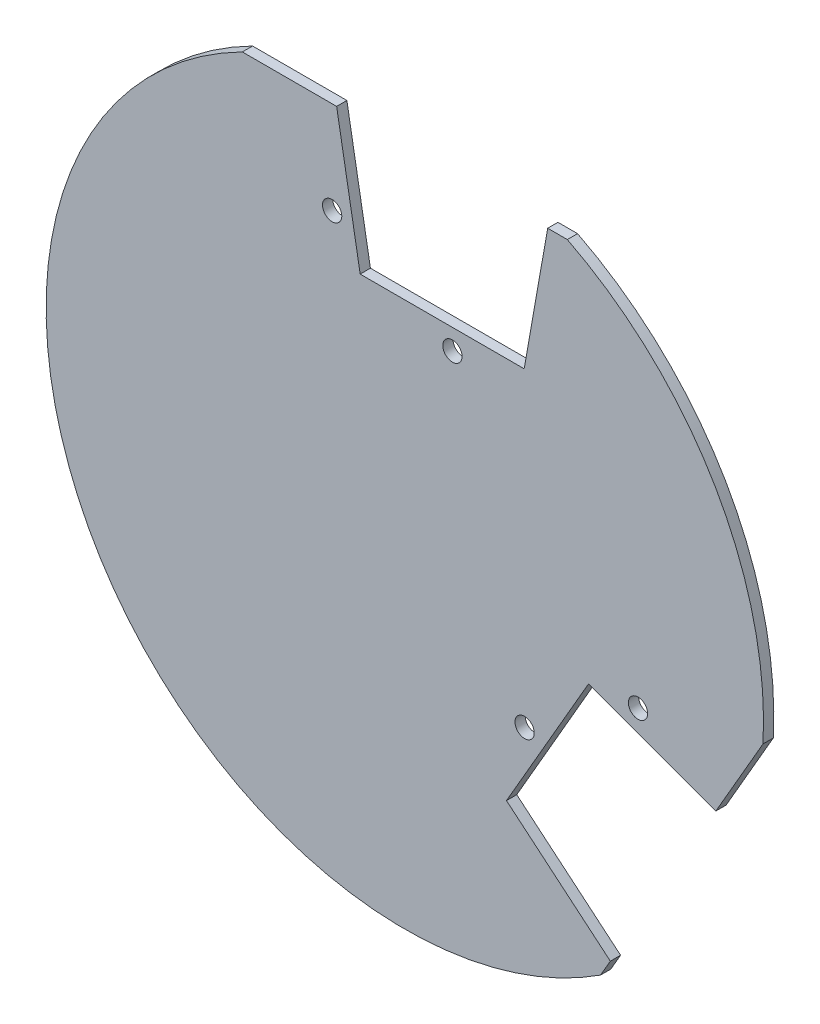
ISO-10303-21;
HEADER;
FILE_DESCRIPTION(('STEP AP214'),'2;1');
FILE_NAME('part.step','',(''),(''),'','','');
FILE_SCHEMA(('AUTOMOTIVE_DESIGN { 1 0 10303 214 1 1 1 1 }'));
ENDSEC;
DATA;
#1=APPLICATION_CONTEXT('core data for automotive mechanical design processes');
#2=APPLICATION_PROTOCOL_DEFINITION('international standard','automotive_design',2000,#1);
#3=PRODUCT_CONTEXT('',#1,'mechanical');
#4=PRODUCT('Part','Part','',(#3));
#5=PRODUCT_RELATED_PRODUCT_CATEGORY('part','',(#4));
#6=PRODUCT_DEFINITION_FORMATION('','',#4);
#7=PRODUCT_DEFINITION_CONTEXT('part definition',#1,'design');
#8=PRODUCT_DEFINITION('design','',#6,#7);
#9=PRODUCT_DEFINITION_SHAPE('','',#8);
#10=(LENGTH_UNIT() NAMED_UNIT(*) SI_UNIT(.MILLI.,.METRE.));
#11=(NAMED_UNIT(*) PLANE_ANGLE_UNIT() SI_UNIT($,.RADIAN.));
#12=(NAMED_UNIT(*) SI_UNIT($,.STERADIAN.) SOLID_ANGLE_UNIT());
#13=UNCERTAINTY_MEASURE_WITH_UNIT(LENGTH_MEASURE(1.E-05),#10,'distance_accuracy_value','');
#14=(GEOMETRIC_REPRESENTATION_CONTEXT(3) GLOBAL_UNCERTAINTY_ASSIGNED_CONTEXT((#13)) GLOBAL_UNIT_ASSIGNED_CONTEXT((#10,
#11,#12)) REPRESENTATION_CONTEXT('',''));
#15=CARTESIAN_POINT('',(0.,0.,0.));
#16=DIRECTION('',(0.,0.,1.));
#17=DIRECTION('',(1.,0.,0.));
#18=AXIS2_PLACEMENT_3D('',#15,#16,#17);
#19=CARTESIAN_POINT('',(0.,0.,5.));
#20=DIRECTION('',(0.,0.,-1.));
#21=DIRECTION('',(-1.,0.,0.));
#22=AXIS2_PLACEMENT_3D('',#19,#20,#21);
#23=CYLINDRICAL_SURFACE('',#22,175.);
#24=CARTESIAN_POINT('',(0.,0.,0.));
#25=DIRECTION('',(0.,0.,1.));
#26=DIRECTION('',(1.,0.,0.));
#27=AXIS2_PLACEMENT_3D('',#24,#25,#26);
#28=CIRCLE('',#27,175.);
#29=CARTESIAN_POINT('',(-79.2733847732147,156.015161015197,0.));
#30=VERTEX_POINT('',#29);
#31=CARTESIAN_POINT('',(95.4764004280729,-146.660345565181,0.));
#32=VERTEX_POINT('',#31);
#33=EDGE_CURVE('E238',#30,#32,#28,.T.);
#34=ORIENTED_EDGE('',*,*,#33,.T.);
#35=DIRECTION('',(0.,0.,-1.));
#36=VECTOR('',#35,1.);
#37=CARTESIAN_POINT('',(95.4764004280728,-146.660345565181,5.));
#38=LINE('',#37,#36);
#39=CARTESIAN_POINT('',(95.4764004280729,-146.660345565181,5.));
#40=VERTEX_POINT('',#39);
#41=EDGE_CURVE('E160',#32,#40,#38,.F.);
#42=ORIENTED_EDGE('',*,*,#41,.T.);
#43=CARTESIAN_POINT('',(0.,0.,5.));
#44=DIRECTION('',(0.,0.,1.));
#45=DIRECTION('',(1.,0.,0.));
#46=AXIS2_PLACEMENT_3D('',#43,#44,#45);
#47=CIRCLE('',#46,175.);
#48=CARTESIAN_POINT('',(-79.2733847732147,156.015161015197,5.));
#49=VERTEX_POINT('',#48);
#50=EDGE_CURVE('E234',#49,#40,#47,.T.);
#51=ORIENTED_EDGE('',*,*,#50,.F.);
#52=DIRECTION('',(0.,0.,-1.));
#53=VECTOR('',#52,1.);
#54=CARTESIAN_POINT('',(-79.2733847732147,156.015161015197,5.));
#55=LINE('',#54,#53);
#56=EDGE_CURVE('E201',#49,#30,#55,.T.);
#57=ORIENTED_EDGE('',*,*,#56,.T.);
#58=EDGE_LOOP('',(#34,#42,#51,#57));
#59=FACE_BOUND('',#58,.T.);
#60=ADVANCED_FACE('F33',(#59),#23,.T.);
#61=CARTESIAN_POINT('',(174.749785201287,-9.35481545001618,5.));
#62=VERTEX_POINT('',#61);
#63=CARTESIAN_POINT('',(79.2733847732147,156.015161015197,5.));
#64=VERTEX_POINT('',#63);
#65=EDGE_CURVE('E237',#62,#64,#47,.T.);
#66=ORIENTED_EDGE('',*,*,#65,.F.);
#67=DIRECTION('',(0.,0.,-1.));
#68=VECTOR('',#67,1.);
#69=CARTESIAN_POINT('',(174.749785201287,-9.35481545001618,5.));
#70=LINE('',#69,#68);
#71=CARTESIAN_POINT('',(174.749785201287,-9.35481545001618,0.));
#72=VERTEX_POINT('',#71);
#73=EDGE_CURVE('E164',#62,#72,#70,.T.);
#74=ORIENTED_EDGE('',*,*,#73,.T.);
#75=CARTESIAN_POINT('',(79.2733847732147,156.015161015197,0.));
#76=VERTEX_POINT('',#75);
#77=EDGE_CURVE('E231',#72,#76,#28,.T.);
#78=ORIENTED_EDGE('',*,*,#77,.T.);
#79=DIRECTION('',(0.,0.,-1.));
#80=VECTOR('',#79,1.);
#81=CARTESIAN_POINT('',(79.2733847732147,156.015161015197,5.));
#82=LINE('',#81,#80);
#83=EDGE_CURVE('E197',#76,#64,#82,.F.);
#84=ORIENTED_EDGE('',*,*,#83,.T.);
#85=EDGE_LOOP('',(#66,#74,#78,#84));
#86=FACE_BOUND('',#85,.T.);
#87=ADVANCED_FACE('F35',(#86),#23,.T.);
#88=CARTESIAN_POINT('',(0.,0.,5.));
#89=DIRECTION('',(0.,0.,1.));
#90=DIRECTION('',(1.,0.,0.));
#91=AXIS2_PLACEMENT_3D('',#88,#89,#90);
#92=PLANE('',#91);
#93=DIRECTION('',(0.5,0.866025403784439,0.));
#94=VECTOR('',#93,1.);
#95=CARTESIAN_POINT('',(100.261007389645,-138.373163213491,5.));
#96=LINE('',#95,#94);
#97=CARTESIAN_POINT('',(100.261007389645,-138.373163213491,5.));
#98=VERTEX_POINT('',#97);
#99=EDGE_CURVE('E151',#40,#98,#96,.T.);
#100=ORIENTED_EDGE('',*,*,#99,.T.);
#101=DIRECTION('',(-0.766044443118982,0.642787609686535,0.));
#102=VECTOR('',#101,1.);
#103=CARTESIAN_POINT('',(49.6007680483994,-95.8641750668996,5.));
#104=LINE('',#103,#102);
#105=CARTESIAN_POINT('',(49.6007680483994,-95.8641750668996,5.));
#106=VERTEX_POINT('',#105);
#107=EDGE_CURVE('E130',#98,#106,#104,.T.);
#108=ORIENTED_EDGE('',*,*,#107,.T.);
#109=DIRECTION('',(0.5,0.866025403784439,0.));
#110=VECTOR('',#109,1.);
#111=CARTESIAN_POINT('',(89.6007680483994,-26.5821427641446,5.));
#112=LINE('',#111,#110);
#113=CARTESIAN_POINT('',(89.6007680483994,-26.5821427641446,5.));
#114=VERTEX_POINT('',#113);
#115=EDGE_CURVE('E124',#106,#114,#112,.T.);
#116=ORIENTED_EDGE('',*,*,#115,.T.);
#117=DIRECTION('',(0.939692620785906,-0.342020143325675,0.));
#118=VECTOR('',#117,1.);
#119=CARTESIAN_POINT('',(89.6007680483994,-26.5821427641446,5.));
#120=LINE('',#119,#118);
#121=CARTESIAN_POINT('',(151.744751343142,-49.2007029221673,5.));
#122=VERTEX_POINT('',#121);
#123=EDGE_CURVE('E133',#114,#122,#120,.T.);
#124=ORIENTED_EDGE('',*,*,#123,.T.);
#125=DIRECTION('',(0.5,0.866025403784439,0.));
#126=VECTOR('',#125,1.);
#127=CARTESIAN_POINT('',(151.744751343142,-49.2007029221673,5.));
#128=LINE('',#127,#126);
#129=EDGE_CURVE('E138',#122,#62,#128,.T.);
#130=ORIENTED_EDGE('',*,*,#129,.T.);
#131=ORIENTED_EDGE('',*,*,#65,.T.);
#132=DIRECTION('',(-1.,0.,0.));
#133=VECTOR('',#132,1.);
#134=CARTESIAN_POINT('',(69.704170850071,156.015161015197,5.));
#135=LINE('',#134,#133);
#136=CARTESIAN_POINT('',(69.704170850071,156.015161015197,5.));
#137=VERTEX_POINT('',#136);
#138=EDGE_CURVE('E180',#64,#137,#135,.T.);
#139=ORIENTED_EDGE('',*,*,#138,.T.);
#140=DIRECTION('',(-0.173648177666924,-0.984807753012209,0.));
#141=VECTOR('',#140,1.);
#142=CARTESIAN_POINT('',(58.2204268965742,90.8876127105832,5.));
#143=LINE('',#142,#141);
#144=CARTESIAN_POINT('',(58.2204268965742,90.8876127105832,5.));
#145=VERTEX_POINT('',#144);
#146=EDGE_CURVE('E183',#137,#145,#143,.T.);
#147=ORIENTED_EDGE('',*,*,#146,.T.);
#148=DIRECTION('',(-1.,0.,0.));
#149=VECTOR('',#148,1.);
#150=CARTESIAN_POINT('',(-21.7795731034258,90.8876127105832,5.));
#151=LINE('',#150,#149);
#152=CARTESIAN_POINT('',(-21.7795731034258,90.8876127105832,5.));
#153=VERTEX_POINT('',#152);
#154=EDGE_CURVE('E170',#145,#153,#151,.T.);
#155=ORIENTED_EDGE('',*,*,#154,.T.);
#156=DIRECTION('',(-0.173648177666924,0.984807753012209,0.));
#157=VECTOR('',#156,1.);
#158=CARTESIAN_POINT('',(-21.7795731034258,90.8876127105832,5.));
#159=LINE('',#158,#157);
#160=CARTESIAN_POINT('',(-33.2633170569227,156.015161015197,5.));
#161=VERTEX_POINT('',#160);
#162=EDGE_CURVE('E173',#153,#161,#159,.T.);
#163=ORIENTED_EDGE('',*,*,#162,.T.);
#164=DIRECTION('',(-1.,0.,0.));
#165=VECTOR('',#164,1.);
#166=CARTESIAN_POINT('',(-33.2633170569227,156.015161015197,5.));
#167=LINE('',#166,#165);
#168=EDGE_CURVE('E177',#161,#49,#167,.T.);
#169=ORIENTED_EDGE('',*,*,#168,.T.);
#170=ORIENTED_EDGE('',*,*,#50,.T.);
#171=EDGE_LOOP('',(#100,#108,#116,#124,#130,#131,#139,#147,#155,#163,#169,#170));
#172=FACE_BOUND('',#171,.T.);
#173=CARTESIAN_POINT('',(113.761678990601,-24.7342174551037,5.));
#174=DIRECTION('',(0.,0.,-1.));
#175=DIRECTION('',(-1.,0.,0.));
#176=AXIS2_PLACEMENT_3D('',#173,#174,#175);
#177=CIRCLE('',#176,4.69999999999997);
#178=CARTESIAN_POINT('',(109.061678990601,-24.7342174551037,5.));
#179=VERTEX_POINT('',#178);
#180=EDGE_CURVE('E210',#179,#179,#177,.T.);
#181=ORIENTED_EDGE('',*,*,#180,.T.);
#182=EDGE_LOOP('',(#181));
#183=FACE_BOUND('',#182,.T.);
#184=CARTESIAN_POINT('',(58.440514010555,-60.5532859344442,5.));
#185=DIRECTION('',(0.,0.,-1.));
#186=DIRECTION('',(-1.,0.,0.));
#187=AXIS2_PLACEMENT_3D('',#184,#185,#186);
#188=CIRCLE('',#187,4.69999999999996);
#189=CARTESIAN_POINT('',(53.740514010555,-60.5532859344442,5.));
#190=VERTEX_POINT('',#189);
#191=EDGE_CURVE('E216',#190,#190,#188,.T.);
#192=ORIENTED_EDGE('',*,*,#191,.T.);
#193=EDGE_LOOP('',(#192));
#194=FACE_BOUND('',#193,.T.);
#195=CARTESIAN_POINT('',(-35.4603788364524,110.887612710583,5.));
#196=DIRECTION('',(0.,0.,-1.));
#197=DIRECTION('',(-1.,0.,0.));
#198=AXIS2_PLACEMENT_3D('',#195,#196,#197);
#199=CIRCLE('',#198,4.69999999999995);
#200=CARTESIAN_POINT('',(-40.1603788364524,110.887612710583,5.));
#201=VERTEX_POINT('',#200);
#202=EDGE_CURVE('E222',#201,#201,#199,.T.);
#203=ORIENTED_EDGE('',*,*,#202,.T.);
#204=EDGE_LOOP('',(#203));
#205=FACE_BOUND('',#204,.T.);
#206=CARTESIAN_POINT('',(23.2204268965741,80.8876127105831,5.));
#207=DIRECTION('',(0.,0.,-1.));
#208=DIRECTION('',(-1.,0.,0.));
#209=AXIS2_PLACEMENT_3D('',#206,#207,#208);
#210=CIRCLE('',#209,4.69999999999995);
#211=CARTESIAN_POINT('',(18.5204268965741,80.8876127105831,5.));
#212=VERTEX_POINT('',#211);
#213=EDGE_CURVE('E228',#212,#212,#210,.T.);
#214=ORIENTED_EDGE('',*,*,#213,.T.);
#215=EDGE_LOOP('',(#214));
#216=FACE_BOUND('',#215,.T.);
#217=ADVANCED_FACE('F141',(#172,#183,#194,#205,#216),#92,.T.);
#218=CARTESIAN_POINT('',(0.,0.,0.));
#219=DIRECTION('',(0.,0.,1.));
#220=DIRECTION('',(1.,0.,0.));
#221=AXIS2_PLACEMENT_3D('',#218,#219,#220);
#222=PLANE('',#221);
#223=CARTESIAN_POINT('',(113.761678990601,-24.7342174551037,0.));
#224=DIRECTION('',(0.,0.,-1.));
#225=DIRECTION('',(-1.,0.,0.));
#226=AXIS2_PLACEMENT_3D('',#223,#224,#225);
#227=CIRCLE('',#226,4.69999999999997);
#228=CARTESIAN_POINT('',(109.061678990601,-24.7342174551037,0.));
#229=VERTEX_POINT('',#228);
#230=EDGE_CURVE('E209',#229,#229,#227,.T.);
#231=ORIENTED_EDGE('',*,*,#230,.F.);
#232=EDGE_LOOP('',(#231));
#233=FACE_BOUND('',#232,.T.);
#234=CARTESIAN_POINT('',(58.440514010555,-60.5532859344442,0.));
#235=DIRECTION('',(0.,0.,-1.));
#236=DIRECTION('',(-1.,0.,0.));
#237=AXIS2_PLACEMENT_3D('',#234,#235,#236);
#238=CIRCLE('',#237,4.69999999999996);
#239=CARTESIAN_POINT('',(53.740514010555,-60.5532859344442,0.));
#240=VERTEX_POINT('',#239);
#241=EDGE_CURVE('E213',#240,#240,#238,.T.);
#242=ORIENTED_EDGE('',*,*,#241,.F.);
#243=EDGE_LOOP('',(#242));
#244=FACE_BOUND('',#243,.T.);
#245=CARTESIAN_POINT('',(-35.4603788364524,110.887612710583,0.));
#246=DIRECTION('',(0.,0.,-1.));
#247=DIRECTION('',(-1.,0.,0.));
#248=AXIS2_PLACEMENT_3D('',#245,#246,#247);
#249=CIRCLE('',#248,4.69999999999995);
#250=CARTESIAN_POINT('',(-40.1603788364524,110.887612710583,0.));
#251=VERTEX_POINT('',#250);
#252=EDGE_CURVE('E219',#251,#251,#249,.T.);
#253=ORIENTED_EDGE('',*,*,#252,.F.);
#254=EDGE_LOOP('',(#253));
#255=FACE_BOUND('',#254,.T.);
#256=CARTESIAN_POINT('',(23.2204268965741,80.8876127105831,0.));
#257=DIRECTION('',(0.,0.,-1.));
#258=DIRECTION('',(-1.,0.,0.));
#259=AXIS2_PLACEMENT_3D('',#256,#257,#258);
#260=CIRCLE('',#259,4.69999999999995);
#261=CARTESIAN_POINT('',(18.5204268965741,80.8876127105831,0.));
#262=VERTEX_POINT('',#261);
#263=EDGE_CURVE('E225',#262,#262,#260,.T.);
#264=ORIENTED_EDGE('',*,*,#263,.F.);
#265=EDGE_LOOP('',(#264));
#266=FACE_BOUND('',#265,.T.);
#267=DIRECTION('',(-0.766044443118982,0.642787609686535,0.));
#268=VECTOR('',#267,1.);
#269=CARTESIAN_POINT('',(49.6007680483994,-95.8641750668996,0.));
#270=LINE('',#269,#268);
#271=CARTESIAN_POINT('',(100.261007389645,-138.373163213491,0.));
#272=VERTEX_POINT('',#271);
#273=CARTESIAN_POINT('',(49.6007680483994,-95.8641750668996,0.));
#274=VERTEX_POINT('',#273);
#275=EDGE_CURVE('E144',#272,#274,#270,.T.);
#276=ORIENTED_EDGE('',*,*,#275,.F.);
#277=DIRECTION('',(-0.5,-0.866025403784439,0.));
#278=VECTOR('',#277,1.);
#279=CARTESIAN_POINT('',(135.11309281468,-78.0075805075985,0.));
#280=LINE('',#279,#278);
#281=EDGE_CURVE('E11',#272,#32,#280,.T.);
#282=ORIENTED_EDGE('',*,*,#281,.T.);
#283=ORIENTED_EDGE('',*,*,#33,.F.);
#284=DIRECTION('',(-1.,0.,0.));
#285=VECTOR('',#284,1.);
#286=CARTESIAN_POINT('',(-33.2633170569227,156.015161015197,0.));
#287=LINE('',#286,#285);
#288=CARTESIAN_POINT('',(-33.2633170569227,156.015161015197,0.));
#289=VERTEX_POINT('',#288);
#290=EDGE_CURVE('E191',#289,#30,#287,.T.);
#291=ORIENTED_EDGE('',*,*,#290,.F.);
#292=DIRECTION('',(-0.173648177666924,0.984807753012209,0.));
#293=VECTOR('',#292,1.);
#294=CARTESIAN_POINT('',(-21.7795731034258,90.8876127105832,0.));
#295=LINE('',#294,#293);
#296=CARTESIAN_POINT('',(-21.7795731034258,90.8876127105832,0.));
#297=VERTEX_POINT('',#296);
#298=EDGE_CURVE('E188',#297,#289,#295,.T.);
#299=ORIENTED_EDGE('',*,*,#298,.F.);
#300=DIRECTION('',(-1.,0.,0.));
#301=VECTOR('',#300,1.);
#302=CARTESIAN_POINT('',(-21.7795731034258,90.8876127105832,0.));
#303=LINE('',#302,#301);
#304=CARTESIAN_POINT('',(58.2204268965742,90.8876127105832,0.));
#305=VERTEX_POINT('',#304);
#306=EDGE_CURVE('E56',#305,#297,#303,.T.);
#307=ORIENTED_EDGE('',*,*,#306,.F.);
#308=DIRECTION('',(-0.173648177666924,-0.984807753012209,0.));
#309=VECTOR('',#308,1.);
#310=CARTESIAN_POINT('',(58.2204268965742,90.8876127105832,0.));
#311=LINE('',#310,#309);
#312=CARTESIAN_POINT('',(69.704170850071,156.015161015197,0.));
#313=VERTEX_POINT('',#312);
#314=EDGE_CURVE('E174',#313,#305,#311,.T.);
#315=ORIENTED_EDGE('',*,*,#314,.F.);
#316=DIRECTION('',(1.,0.,0.));
#317=VECTOR('',#316,1.);
#318=CARTESIAN_POINT('',(0.,156.015161015197,0.));
#319=LINE('',#318,#317);
#320=EDGE_CURVE('E41',#313,#76,#319,.T.);
#321=ORIENTED_EDGE('',*,*,#320,.T.);
#322=ORIENTED_EDGE('',*,*,#77,.F.);
#323=DIRECTION('',(0.5,0.866025403784439,0.));
#324=VECTOR('',#323,1.);
#325=CARTESIAN_POINT('',(151.744751343142,-49.2007029221673,0.));
#326=LINE('',#325,#324);
#327=CARTESIAN_POINT('',(151.744751343142,-49.2007029221673,0.));
#328=VERTEX_POINT('',#327);
#329=EDGE_CURVE('E147',#328,#72,#326,.T.);
#330=ORIENTED_EDGE('',*,*,#329,.F.);
#331=DIRECTION('',(0.939692620785906,-0.342020143325675,0.));
#332=VECTOR('',#331,1.);
#333=CARTESIAN_POINT('',(89.6007680483994,-26.5821427641446,0.));
#334=LINE('',#333,#332);
#335=CARTESIAN_POINT('',(89.6007680483994,-26.5821427641446,0.));
#336=VERTEX_POINT('',#335);
#337=EDGE_CURVE('E155',#336,#328,#334,.T.);
#338=ORIENTED_EDGE('',*,*,#337,.F.);
#339=DIRECTION('',(0.5,0.866025403784439,0.));
#340=VECTOR('',#339,1.);
#341=CARTESIAN_POINT('',(89.6007680483994,-26.5821427641446,0.));
#342=LINE('',#341,#340);
#343=EDGE_CURVE('E48',#274,#336,#342,.T.);
#344=ORIENTED_EDGE('',*,*,#343,.F.);
#345=EDGE_LOOP('',(#276,#282,#283,#291,#299,#307,#315,#321,#322,#330,#338,#344));
#346=FACE_BOUND('',#345,.T.);
#347=ADVANCED_FACE('F245',(#233,#244,#255,#266,#346),#222,.F.);
#348=CARTESIAN_POINT('',(23.2204268965741,80.8876127105831,5.));
#349=DIRECTION('',(0.,0.,-1.));
#350=DIRECTION('',(-1.,0.,0.));
#351=AXIS2_PLACEMENT_3D('',#348,#349,#350);
#352=CYLINDRICAL_SURFACE('',#351,4.69999999999995);
#353=ORIENTED_EDGE('',*,*,#213,.F.);
#354=EDGE_LOOP('',(#353));
#355=FACE_BOUND('',#354,.T.);
#356=ORIENTED_EDGE('',*,*,#263,.T.);
#357=EDGE_LOOP('',(#356));
#358=FACE_BOUND('',#357,.T.);
#359=ADVANCED_FACE('F297',(#355,#358),#352,.F.);
#360=CARTESIAN_POINT('',(-35.4603788364524,110.887612710583,5.));
#361=DIRECTION('',(0.,0.,-1.));
#362=DIRECTION('',(-1.,0.,0.));
#363=AXIS2_PLACEMENT_3D('',#360,#361,#362);
#364=CYLINDRICAL_SURFACE('',#363,4.69999999999995);
#365=ORIENTED_EDGE('',*,*,#202,.F.);
#366=EDGE_LOOP('',(#365));
#367=FACE_BOUND('',#366,.T.);
#368=ORIENTED_EDGE('',*,*,#252,.T.);
#369=EDGE_LOOP('',(#368));
#370=FACE_BOUND('',#369,.T.);
#371=ADVANCED_FACE('F302',(#367,#370),#364,.F.);
#372=CARTESIAN_POINT('',(58.440514010555,-60.5532859344442,5.));
#373=DIRECTION('',(0.,0.,-1.));
#374=DIRECTION('',(-1.,0.,0.));
#375=AXIS2_PLACEMENT_3D('',#372,#373,#374);
#376=CYLINDRICAL_SURFACE('',#375,4.69999999999996);
#377=ORIENTED_EDGE('',*,*,#191,.F.);
#378=EDGE_LOOP('',(#377));
#379=FACE_BOUND('',#378,.T.);
#380=ORIENTED_EDGE('',*,*,#241,.T.);
#381=EDGE_LOOP('',(#380));
#382=FACE_BOUND('',#381,.T.);
#383=ADVANCED_FACE('F306',(#379,#382),#376,.F.);
#384=CARTESIAN_POINT('',(113.761678990601,-24.7342174551037,5.));
#385=DIRECTION('',(0.,0.,-1.));
#386=DIRECTION('',(-1.,0.,0.));
#387=AXIS2_PLACEMENT_3D('',#384,#385,#386);
#388=CYLINDRICAL_SURFACE('',#387,4.69999999999997);
#389=ORIENTED_EDGE('',*,*,#180,.F.);
#390=EDGE_LOOP('',(#389));
#391=FACE_BOUND('',#390,.T.);
#392=ORIENTED_EDGE('',*,*,#230,.T.);
#393=EDGE_LOOP('',(#392));
#394=FACE_BOUND('',#393,.T.);
#395=ADVANCED_FACE('F282',(#391,#394),#388,.F.);
#396=CARTESIAN_POINT('',(69.704170850071,156.015161015197,5.));
#397=DIRECTION('',(0.,-1.,0.));
#398=DIRECTION('',(0.,0.,-1.));
#399=AXIS2_PLACEMENT_3D('',#396,#397,#398);
#400=PLANE('',#399);
#401=ORIENTED_EDGE('',*,*,#320,.F.);
#402=DIRECTION('',(0.,0.,-1.));
#403=VECTOR('',#402,1.);
#404=CARTESIAN_POINT('',(69.704170850071,156.015161015197,5.));
#405=LINE('',#404,#403);
#406=EDGE_CURVE('E198',#137,#313,#405,.T.);
#407=ORIENTED_EDGE('',*,*,#406,.F.);
#408=ORIENTED_EDGE('',*,*,#138,.F.);
#409=ORIENTED_EDGE('',*,*,#83,.F.);
#410=EDGE_LOOP('',(#401,#407,#408,#409));
#411=FACE_BOUND('',#410,.T.);
#412=ADVANCED_FACE('F249',(#411),#400,.F.);
#413=CARTESIAN_POINT('',(-21.7795731034258,90.8876127105832,5.));
#414=DIRECTION('',(0.,-1.,0.));
#415=DIRECTION('',(0.,0.,-1.));
#416=AXIS2_PLACEMENT_3D('',#413,#414,#415);
#417=PLANE('',#416);
#418=ORIENTED_EDGE('',*,*,#306,.T.);
#419=DIRECTION('',(0.,0.,-1.));
#420=VECTOR('',#419,1.);
#421=CARTESIAN_POINT('',(-21.7795731034258,90.8876127105832,5.));
#422=LINE('',#421,#420);
#423=EDGE_CURVE('E186',#153,#297,#422,.T.);
#424=ORIENTED_EDGE('',*,*,#423,.F.);
#425=ORIENTED_EDGE('',*,*,#154,.F.);
#426=DIRECTION('',(0.,0.,-1.));
#427=VECTOR('',#426,1.);
#428=CARTESIAN_POINT('',(58.2204268965742,90.8876127105832,5.));
#429=LINE('',#428,#427);
#430=EDGE_CURVE('E195',#145,#305,#429,.T.);
#431=ORIENTED_EDGE('',*,*,#430,.T.);
#432=EDGE_LOOP('',(#418,#424,#425,#431));
#433=FACE_BOUND('',#432,.T.);
#434=ADVANCED_FACE('F274',(#433),#417,.F.);
#435=CARTESIAN_POINT('',(58.2204268965742,90.8876127105832,5.));
#436=DIRECTION('',(0.984807753012209,-0.173648177666924,0.));
#437=DIRECTION('',(0.173648177666924,0.984807753012209,0.));
#438=AXIS2_PLACEMENT_3D('',#435,#436,#437);
#439=PLANE('',#438);
#440=ORIENTED_EDGE('',*,*,#314,.T.);
#441=ORIENTED_EDGE('',*,*,#430,.F.);
#442=ORIENTED_EDGE('',*,*,#146,.F.);
#443=ORIENTED_EDGE('',*,*,#406,.T.);
#444=EDGE_LOOP('',(#440,#441,#442,#443));
#445=FACE_BOUND('',#444,.T.);
#446=ADVANCED_FACE('F253',(#445),#439,.F.);
#447=CARTESIAN_POINT('',(-33.2633170569227,156.015161015197,5.));
#448=DIRECTION('',(0.,-1.,0.));
#449=DIRECTION('',(0.,0.,-1.));
#450=AXIS2_PLACEMENT_3D('',#447,#448,#449);
#451=PLANE('',#450);
#452=ORIENTED_EDGE('',*,*,#290,.T.);
#453=ORIENTED_EDGE('',*,*,#56,.F.);
#454=ORIENTED_EDGE('',*,*,#168,.F.);
#455=DIRECTION('',(0.,0.,-1.));
#456=VECTOR('',#455,1.);
#457=CARTESIAN_POINT('',(-33.2633170569227,156.015161015197,5.));
#458=LINE('',#457,#456);
#459=EDGE_CURVE('E204',#161,#289,#458,.T.);
#460=ORIENTED_EDGE('',*,*,#459,.T.);
#461=EDGE_LOOP('',(#452,#453,#454,#460));
#462=FACE_BOUND('',#461,.T.);
#463=ADVANCED_FACE('F269',(#462),#451,.F.);
#464=CARTESIAN_POINT('',(-21.7795731034258,90.8876127105832,5.));
#465=DIRECTION('',(-0.984807753012209,-0.173648177666924,0.));
#466=DIRECTION('',(0.173648177666924,-0.984807753012209,0.));
#467=AXIS2_PLACEMENT_3D('',#464,#465,#466);
#468=PLANE('',#467);
#469=ORIENTED_EDGE('',*,*,#298,.T.);
#470=ORIENTED_EDGE('',*,*,#459,.F.);
#471=ORIENTED_EDGE('',*,*,#162,.F.);
#472=ORIENTED_EDGE('',*,*,#423,.T.);
#473=EDGE_LOOP('',(#469,#470,#471,#472));
#474=FACE_BOUND('',#473,.T.);
#475=ADVANCED_FACE('F273',(#474),#468,.F.);
#476=CARTESIAN_POINT('',(100.261007389645,-138.373163213491,5.));
#477=DIRECTION('',(-0.866025403784439,0.5,0.));
#478=DIRECTION('',(-0.5,-0.866025403784439,0.));
#479=AXIS2_PLACEMENT_3D('',#476,#477,#478);
#480=PLANE('',#479);
#481=ORIENTED_EDGE('',*,*,#281,.F.);
#482=DIRECTION('',(0.,0.,-1.));
#483=VECTOR('',#482,1.);
#484=CARTESIAN_POINT('',(100.261007389645,-138.373163213491,5.));
#485=LINE('',#484,#483);
#486=EDGE_CURVE('E161',#98,#272,#485,.T.);
#487=ORIENTED_EDGE('',*,*,#486,.F.);
#488=ORIENTED_EDGE('',*,*,#99,.F.);
#489=ORIENTED_EDGE('',*,*,#41,.F.);
#490=EDGE_LOOP('',(#481,#487,#488,#489));
#491=FACE_BOUND('',#490,.T.);
#492=ADVANCED_FACE('F263',(#491),#480,.F.);
#493=CARTESIAN_POINT('',(89.6007680483994,-26.5821427641446,5.));
#494=DIRECTION('',(-0.866025403784438,0.5,0.));
#495=DIRECTION('',(-0.5,-0.866025403784438,0.));
#496=AXIS2_PLACEMENT_3D('',#493,#494,#495);
#497=PLANE('',#496);
#498=ORIENTED_EDGE('',*,*,#343,.T.);
#499=DIRECTION('',(0.,0.,-1.));
#500=VECTOR('',#499,1.);
#501=CARTESIAN_POINT('',(89.6007680483994,-26.5821427641446,5.));
#502=LINE('',#501,#500);
#503=EDGE_CURVE('E120',#114,#336,#502,.T.);
#504=ORIENTED_EDGE('',*,*,#503,.F.);
#505=ORIENTED_EDGE('',*,*,#115,.F.);
#506=DIRECTION('',(0.,0.,-1.));
#507=VECTOR('',#506,1.);
#508=CARTESIAN_POINT('',(49.6007680483994,-95.8641750668996,5.));
#509=LINE('',#508,#507);
#510=EDGE_CURVE('E158',#106,#274,#509,.T.);
#511=ORIENTED_EDGE('',*,*,#510,.T.);
#512=EDGE_LOOP('',(#498,#504,#505,#511));
#513=FACE_BOUND('',#512,.T.);
#514=ADVANCED_FACE('F122',(#513),#497,.F.);
#515=CARTESIAN_POINT('',(49.6007680483994,-95.8641750668996,5.));
#516=DIRECTION('',(-0.642787609686535,-0.766044443118982,0.));
#517=DIRECTION('',(0.766044443118982,-0.642787609686535,0.));
#518=AXIS2_PLACEMENT_3D('',#515,#516,#517);
#519=PLANE('',#518);
#520=ORIENTED_EDGE('',*,*,#275,.T.);
#521=ORIENTED_EDGE('',*,*,#510,.F.);
#522=ORIENTED_EDGE('',*,*,#107,.F.);
#523=ORIENTED_EDGE('',*,*,#486,.T.);
#524=EDGE_LOOP('',(#520,#521,#522,#523));
#525=FACE_BOUND('',#524,.T.);
#526=ADVANCED_FACE('F261',(#525),#519,.F.);
#527=CARTESIAN_POINT('',(151.744751343142,-49.2007029221673,5.));
#528=DIRECTION('',(-0.866025403784439,0.5,0.));
#529=DIRECTION('',(-0.5,-0.866025403784439,0.));
#530=AXIS2_PLACEMENT_3D('',#527,#528,#529);
#531=PLANE('',#530);
#532=ORIENTED_EDGE('',*,*,#329,.T.);
#533=ORIENTED_EDGE('',*,*,#73,.F.);
#534=ORIENTED_EDGE('',*,*,#129,.F.);
#535=DIRECTION('',(0.,0.,-1.));
#536=VECTOR('',#535,1.);
#537=CARTESIAN_POINT('',(151.744751343142,-49.2007029221673,5.));
#538=LINE('',#537,#536);
#539=EDGE_CURVE('E129',#122,#328,#538,.T.);
#540=ORIENTED_EDGE('',*,*,#539,.T.);
#541=EDGE_LOOP('',(#532,#533,#534,#540));
#542=FACE_BOUND('',#541,.T.);
#543=ADVANCED_FACE('F258',(#542),#531,.F.);
#544=CARTESIAN_POINT('',(89.6007680483994,-26.5821427641446,5.));
#545=DIRECTION('',(0.342020143325675,0.939692620785906,0.));
#546=DIRECTION('',(-0.939692620785906,0.342020143325675,0.));
#547=AXIS2_PLACEMENT_3D('',#544,#545,#546);
#548=PLANE('',#547);
#549=ORIENTED_EDGE('',*,*,#337,.T.);
#550=ORIENTED_EDGE('',*,*,#539,.F.);
#551=ORIENTED_EDGE('',*,*,#123,.F.);
#552=ORIENTED_EDGE('',*,*,#503,.T.);
#553=EDGE_LOOP('',(#549,#550,#551,#552));
#554=FACE_BOUND('',#553,.T.);
#555=ADVANCED_FACE('F134',(#554),#548,.F.);
#556=CLOSED_SHELL('',(#60,#87,#217,#347,#359,#371,#383,#395,#412,#434,#446,#463,#475,#492,#514,
#526,#543,#555));
#557=MANIFOLD_SOLID_BREP('B2',#556);
#558=ADVANCED_BREP_SHAPE_REPRESENTATION('',(#18,#557),#14);
#559=SHAPE_DEFINITION_REPRESENTATION(#9,#558);
ENDSEC;
END-ISO-10303-21;
